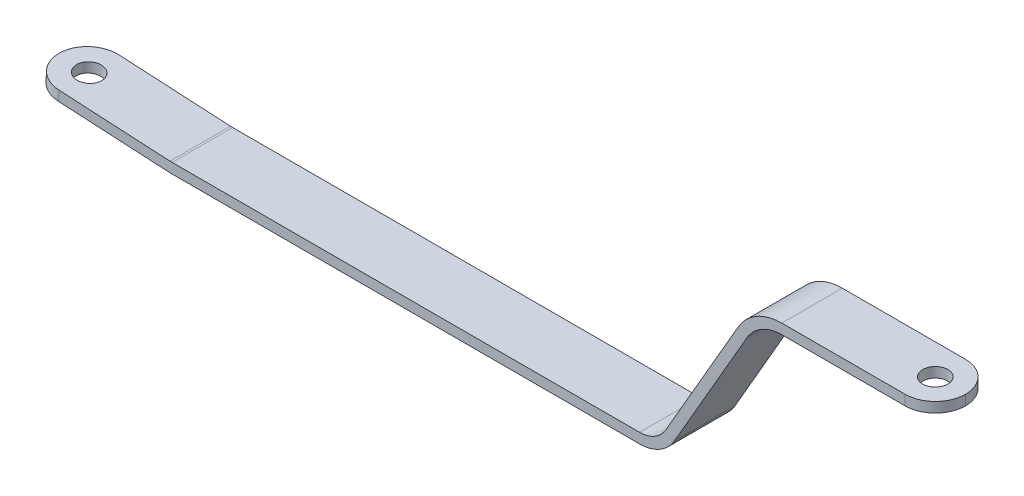
ISO-10303-21;
HEADER;
FILE_DESCRIPTION(('STEP AP214'),'2;1');
FILE_NAME('part.step','',(''),(''),'','','');
FILE_SCHEMA(('AUTOMOTIVE_DESIGN { 1 0 10303 214 1 1 1 1 }'));
ENDSEC;
DATA;
#1=APPLICATION_CONTEXT('core data for automotive mechanical design processes');
#2=APPLICATION_PROTOCOL_DEFINITION('international standard','automotive_design',2000,#1);
#3=PRODUCT_CONTEXT('',#1,'mechanical');
#4=PRODUCT('Part','Part','',(#3));
#5=PRODUCT_RELATED_PRODUCT_CATEGORY('part','',(#4));
#6=PRODUCT_DEFINITION_FORMATION('','',#4);
#7=PRODUCT_DEFINITION_CONTEXT('part definition',#1,'design');
#8=PRODUCT_DEFINITION('design','',#6,#7);
#9=PRODUCT_DEFINITION_SHAPE('','',#8);
#10=(LENGTH_UNIT() NAMED_UNIT(*) SI_UNIT(.MILLI.,.METRE.));
#11=(NAMED_UNIT(*) PLANE_ANGLE_UNIT() SI_UNIT($,.RADIAN.));
#12=(NAMED_UNIT(*) SI_UNIT($,.STERADIAN.) SOLID_ANGLE_UNIT());
#13=UNCERTAINTY_MEASURE_WITH_UNIT(LENGTH_MEASURE(1.E-05),#10,'distance_accuracy_value','');
#14=(GEOMETRIC_REPRESENTATION_CONTEXT(3) GLOBAL_UNCERTAINTY_ASSIGNED_CONTEXT((#13)) GLOBAL_UNIT_ASSIGNED_CONTEXT((#10,
#11,#12)) REPRESENTATION_CONTEXT('',''));
#15=CARTESIAN_POINT('',(0.,0.,0.));
#16=DIRECTION('',(0.,0.,1.));
#17=DIRECTION('',(1.,0.,0.));
#18=AXIS2_PLACEMENT_3D('',#15,#16,#17);
#19=CARTESIAN_POINT('',(74.7604405789944,15.6717298162515,3.));
#20=DIRECTION('',(0.,1.,0.));
#21=DIRECTION('',(0.,0.,1.));
#22=AXIS2_PLACEMENT_3D('',#19,#20,#21);
#23=PLANE('',#22);
#24=CARTESIAN_POINT('',(86.99,15.6717298162515,0.));
#25=DIRECTION('',(0.,1.,0.));
#26=DIRECTION('',(0.,0.,1.));
#27=AXIS2_PLACEMENT_3D('',#24,#25,#26);
#28=CIRCLE('',#27,1.25);
#29=CARTESIAN_POINT('',(86.99,15.6717298162515,1.25));
#30=VERTEX_POINT('',#29);
#31=EDGE_CURVE('E296',#30,#30,#28,.F.);
#32=ORIENTED_EDGE('',*,*,#31,.F.);
#33=EDGE_LOOP('',(#32));
#34=FACE_BOUND('',#33,.T.);
#35=DIRECTION('',(1.,0.,0.));
#36=VECTOR('',#35,1.);
#37=CARTESIAN_POINT('',(74.7604405789944,15.6717298162515,-3.));
#38=LINE('',#37,#36);
#39=CARTESIAN_POINT('',(74.7604405789944,15.6717298162515,-3.));
#40=VERTEX_POINT('',#39);
#41=CARTESIAN_POINT('',(86.99,15.6717298162515,-3.));
#42=VERTEX_POINT('',#41);
#43=EDGE_CURVE('E211',#40,#42,#38,.T.);
#44=ORIENTED_EDGE('',*,*,#43,.T.);
#45=CARTESIAN_POINT('',(86.99,15.6717298162515,0.));
#46=DIRECTION('',(0.,1.,0.));
#47=DIRECTION('',(0.,0.,1.));
#48=AXIS2_PLACEMENT_3D('',#45,#46,#47);
#49=CIRCLE('',#48,3.);
#50=CARTESIAN_POINT('',(89.99,15.6717298162515,0.));
#51=VERTEX_POINT('',#50);
#52=EDGE_CURVE('E55',#42,#51,#49,.F.);
#53=ORIENTED_EDGE('',*,*,#52,.T.);
#54=CARTESIAN_POINT('',(86.99,15.6717298162515,0.));
#55=DIRECTION('',(0.,1.,0.));
#56=DIRECTION('',(0.,0.,1.));
#57=AXIS2_PLACEMENT_3D('',#54,#55,#56);
#58=CIRCLE('',#57,3.);
#59=CARTESIAN_POINT('',(86.99,15.6717298162515,3.));
#60=VERTEX_POINT('',#59);
#61=EDGE_CURVE('E286',#51,#60,#58,.F.);
#62=ORIENTED_EDGE('',*,*,#61,.T.);
#63=DIRECTION('',(1.,0.,0.));
#64=VECTOR('',#63,1.);
#65=CARTESIAN_POINT('',(74.7604405789944,15.6717298162515,3.));
#66=LINE('',#65,#64);
#67=CARTESIAN_POINT('',(74.7604405789944,15.6717298162515,3.));
#68=VERTEX_POINT('',#67);
#69=EDGE_CURVE('E179',#68,#60,#66,.T.);
#70=ORIENTED_EDGE('',*,*,#69,.F.);
#71=DIRECTION('',(0.,0.,-1.));
#72=VECTOR('',#71,1.);
#73=CARTESIAN_POINT('',(74.7604405789944,15.6717298162515,3.));
#74=LINE('',#73,#72);
#75=EDGE_CURVE('E210',#68,#40,#74,.T.);
#76=ORIENTED_EDGE('',*,*,#75,.T.);
#77=EDGE_LOOP('',(#44,#53,#62,#70,#76));
#78=FACE_BOUND('',#77,.T.);
#79=ADVANCED_FACE('F32',(#34,#78),#23,.F.);
#80=CARTESIAN_POINT('',(74.7604405789944,16.6717298162515,3.));
#81=DIRECTION('',(0.,1.,0.));
#82=DIRECTION('',(0.,0.,1.));
#83=AXIS2_PLACEMENT_3D('',#80,#81,#82);
#84=PLANE('',#83);
#85=CARTESIAN_POINT('',(86.99,16.6717298162515,0.));
#86=DIRECTION('',(0.,1.,0.));
#87=DIRECTION('',(0.,0.,1.));
#88=AXIS2_PLACEMENT_3D('',#85,#86,#87);
#89=CIRCLE('',#88,1.25);
#90=CARTESIAN_POINT('',(86.99,16.6717298162515,1.25));
#91=VERTEX_POINT('',#90);
#92=EDGE_CURVE('E291',#91,#91,#89,.T.);
#93=ORIENTED_EDGE('',*,*,#92,.F.);
#94=EDGE_LOOP('',(#93));
#95=FACE_BOUND('',#94,.T.);
#96=CARTESIAN_POINT('',(86.99,16.6717298162515,0.));
#97=DIRECTION('',(0.,1.,0.));
#98=DIRECTION('',(0.,0.,1.));
#99=AXIS2_PLACEMENT_3D('',#96,#97,#98);
#100=CIRCLE('',#99,3.);
#101=CARTESIAN_POINT('',(86.99,16.6717298162515,3.));
#102=VERTEX_POINT('',#101);
#103=CARTESIAN_POINT('',(89.99,16.6717298162515,0.));
#104=VERTEX_POINT('',#103);
#105=EDGE_CURVE('E41',#102,#104,#100,.T.);
#106=ORIENTED_EDGE('',*,*,#105,.T.);
#107=CARTESIAN_POINT('',(86.99,16.6717298162515,0.));
#108=DIRECTION('',(0.,1.,0.));
#109=DIRECTION('',(0.,0.,1.));
#110=AXIS2_PLACEMENT_3D('',#107,#108,#109);
#111=CIRCLE('',#110,3.);
#112=CARTESIAN_POINT('',(86.99,16.6717298162515,-3.));
#113=VERTEX_POINT('',#112);
#114=EDGE_CURVE('E11',#104,#113,#111,.T.);
#115=ORIENTED_EDGE('',*,*,#114,.T.);
#116=DIRECTION('',(1.,0.,0.));
#117=VECTOR('',#116,1.);
#118=CARTESIAN_POINT('',(74.7604405789944,16.6717298162515,-3.));
#119=LINE('',#118,#117);
#120=CARTESIAN_POINT('',(74.7604405789944,16.6717298162515,-3.));
#121=VERTEX_POINT('',#120);
#122=EDGE_CURVE('E161',#121,#113,#119,.T.);
#123=ORIENTED_EDGE('',*,*,#122,.F.);
#124=DIRECTION('',(0.,0.,-1.));
#125=VECTOR('',#124,1.);
#126=CARTESIAN_POINT('',(74.7604405789944,16.6717298162515,3.));
#127=LINE('',#126,#125);
#128=CARTESIAN_POINT('',(74.7604405789944,16.6717298162515,3.));
#129=VERTEX_POINT('',#128);
#130=EDGE_CURVE('E156',#129,#121,#127,.T.);
#131=ORIENTED_EDGE('',*,*,#130,.F.);
#132=DIRECTION('',(1.,0.,0.));
#133=VECTOR('',#132,1.);
#134=CARTESIAN_POINT('',(74.7604405789944,16.6717298162515,3.));
#135=LINE('',#134,#133);
#136=EDGE_CURVE('E159',#129,#102,#135,.T.);
#137=ORIENTED_EDGE('',*,*,#136,.T.);
#138=EDGE_LOOP('',(#106,#115,#123,#131,#137));
#139=FACE_BOUND('',#138,.T.);
#140=ADVANCED_FACE('F158',(#95,#139),#84,.T.);
#141=CARTESIAN_POINT('',(74.7604405789944,11.6717298162515,3.));
#142=DIRECTION('',(0.,0.,-1.));
#143=DIRECTION('',(-1.,0.,0.));
#144=AXIS2_PLACEMENT_3D('',#141,#142,#143);
#145=CYLINDRICAL_SURFACE('',#144,5.00000000000001);
#146=CARTESIAN_POINT('',(74.7604405789944,11.6717298162515,-3.));
#147=DIRECTION('',(0.,0.,1.));
#148=DIRECTION('',(1.,0.,0.));
#149=AXIS2_PLACEMENT_3D('',#146,#147,#148);
#150=CIRCLE('',#149,5.00000000000001);
#151=CARTESIAN_POINT('',(70.4303135600722,14.1717298162515,-3.));
#152=VERTEX_POINT('',#151);
#153=EDGE_CURVE('E215',#152,#121,#150,.F.);
#154=ORIENTED_EDGE('',*,*,#153,.F.);
#155=DIRECTION('',(0.,0.,-1.));
#156=VECTOR('',#155,1.);
#157=CARTESIAN_POINT('',(70.4303135600722,14.1717298162515,3.));
#158=LINE('',#157,#156);
#159=CARTESIAN_POINT('',(70.4303135600722,14.1717298162515,3.));
#160=VERTEX_POINT('',#159);
#161=EDGE_CURVE('E167',#160,#152,#158,.T.);
#162=ORIENTED_EDGE('',*,*,#161,.F.);
#163=CARTESIAN_POINT('',(74.7604405789944,11.6717298162515,3.));
#164=DIRECTION('',(0.,0.,1.));
#165=DIRECTION('',(1.,0.,0.));
#166=AXIS2_PLACEMENT_3D('',#163,#164,#165);
#167=CIRCLE('',#166,5.00000000000001);
#168=EDGE_CURVE('E174',#160,#129,#167,.F.);
#169=ORIENTED_EDGE('',*,*,#168,.T.);
#170=ORIENTED_EDGE('',*,*,#130,.T.);
#171=EDGE_LOOP('',(#154,#162,#169,#170));
#172=FACE_BOUND('',#171,.T.);
#173=ADVANCED_FACE('F181',(#172),#145,.T.);
#174=CARTESIAN_POINT('',(63.2480762113533,1.7317298162515,3.));
#175=DIRECTION('',(-0.86602540378444,0.499999999999997,0.));
#176=DIRECTION('',(-0.499999999999997,-0.86602540378444,0.));
#177=AXIS2_PLACEMENT_3D('',#174,#175,#176);
#178=PLANE('',#177);
#179=DIRECTION('',(0.499999999999997,0.86602540378444,0.));
#180=VECTOR('',#179,1.);
#181=CARTESIAN_POINT('',(63.2480762113533,1.7317298162515,-3.));
#182=LINE('',#181,#180);
#183=CARTESIAN_POINT('',(63.2480762113533,1.7317298162515,-3.));
#184=VERTEX_POINT('',#183);
#185=EDGE_CURVE('E217',#184,#152,#182,.T.);
#186=ORIENTED_EDGE('',*,*,#185,.F.);
#187=DIRECTION('',(0.,0.,-1.));
#188=VECTOR('',#187,1.);
#189=CARTESIAN_POINT('',(63.2480762113533,1.7317298162515,3.));
#190=LINE('',#189,#188);
#191=CARTESIAN_POINT('',(63.2480762113533,1.7317298162515,3.));
#192=VERTEX_POINT('',#191);
#193=EDGE_CURVE('E267',#192,#184,#190,.T.);
#194=ORIENTED_EDGE('',*,*,#193,.F.);
#195=DIRECTION('',(0.499999999999997,0.86602540378444,0.));
#196=VECTOR('',#195,1.);
#197=CARTESIAN_POINT('',(63.2480762113533,1.7317298162515,3.));
#198=LINE('',#197,#196);
#199=EDGE_CURVE('E182',#192,#160,#198,.T.);
#200=ORIENTED_EDGE('',*,*,#199,.T.);
#201=ORIENTED_EDGE('',*,*,#161,.T.);
#202=EDGE_LOOP('',(#186,#194,#200,#201));
#203=FACE_BOUND('',#202,.T.);
#204=ADVANCED_FACE('F456',(#203),#178,.T.);
#205=CARTESIAN_POINT('',(60.65,3.2317298162515,3.));
#206=DIRECTION('',(0.,0.,-1.));
#207=DIRECTION('',(-1.,0.,0.));
#208=AXIS2_PLACEMENT_3D('',#205,#206,#207);
#209=CYLINDRICAL_SURFACE('',#208,3.);
#210=CARTESIAN_POINT('',(60.65,3.2317298162515,-3.));
#211=DIRECTION('',(0.,0.,1.));
#212=DIRECTION('',(1.,0.,0.));
#213=AXIS2_PLACEMENT_3D('',#210,#211,#212);
#214=CIRCLE('',#213,3.);
#215=CARTESIAN_POINT('',(60.65,0.231729816251496,-3.));
#216=VERTEX_POINT('',#215);
#217=EDGE_CURVE('E220',#216,#184,#214,.T.);
#218=ORIENTED_EDGE('',*,*,#217,.F.);
#219=DIRECTION('',(0.,0.,-1.));
#220=VECTOR('',#219,1.);
#221=CARTESIAN_POINT('',(60.65,0.231729816251496,3.));
#222=LINE('',#221,#220);
#223=CARTESIAN_POINT('',(60.65,0.231729816251496,3.));
#224=VERTEX_POINT('',#223);
#225=EDGE_CURVE('E265',#224,#216,#222,.T.);
#226=ORIENTED_EDGE('',*,*,#225,.F.);
#227=CARTESIAN_POINT('',(60.65,3.2317298162515,3.));
#228=DIRECTION('',(0.,0.,1.));
#229=DIRECTION('',(1.,0.,0.));
#230=AXIS2_PLACEMENT_3D('',#227,#228,#229);
#231=CIRCLE('',#230,3.);
#232=EDGE_CURVE('E184',#224,#192,#231,.T.);
#233=ORIENTED_EDGE('',*,*,#232,.T.);
#234=ORIENTED_EDGE('',*,*,#193,.T.);
#235=EDGE_LOOP('',(#218,#226,#233,#234));
#236=FACE_BOUND('',#235,.T.);
#237=ADVANCED_FACE('F448',(#236),#209,.F.);
#238=CARTESIAN_POINT('',(14.2757326766331,0.231729816251496,3.));
#239=DIRECTION('',(0.,1.,0.));
#240=DIRECTION('',(-1.,0.,0.));
#241=AXIS2_PLACEMENT_3D('',#238,#239,#240);
#242=PLANE('',#241);
#243=DIRECTION('',(1.,0.,0.));
#244=VECTOR('',#243,1.);
#245=CARTESIAN_POINT('',(14.2757326766331,0.231729816251496,-3.));
#246=LINE('',#245,#244);
#247=CARTESIAN_POINT('',(14.2757326766331,0.231729816251496,-3.));
#248=VERTEX_POINT('',#247);
#249=EDGE_CURVE('E223',#248,#216,#246,.T.);
#250=ORIENTED_EDGE('',*,*,#249,.F.);
#251=DIRECTION('',(0.,0.,-1.));
#252=VECTOR('',#251,1.);
#253=CARTESIAN_POINT('',(14.2757326766331,0.231729816251496,3.));
#254=LINE('',#253,#252);
#255=CARTESIAN_POINT('',(14.2757326766331,0.231729816251496,3.));
#256=VERTEX_POINT('',#255);
#257=EDGE_CURVE('E263',#256,#248,#254,.T.);
#258=ORIENTED_EDGE('',*,*,#257,.F.);
#259=DIRECTION('',(1.,0.,0.));
#260=VECTOR('',#259,1.);
#261=CARTESIAN_POINT('',(14.2757326766331,0.231729816251496,3.));
#262=LINE('',#261,#260);
#263=EDGE_CURVE('E190',#256,#224,#262,.T.);
#264=ORIENTED_EDGE('',*,*,#263,.T.);
#265=ORIENTED_EDGE('',*,*,#225,.T.);
#266=EDGE_LOOP('',(#250,#258,#264,#265));
#267=FACE_BOUND('',#266,.T.);
#268=ADVANCED_FACE('F440',(#267),#242,.T.);
#269=CARTESIAN_POINT('',(14.2757326766331,4.2317298162515,3.));
#270=DIRECTION('',(0.,0.,-1.));
#271=DIRECTION('',(-1.,0.,0.));
#272=AXIS2_PLACEMENT_3D('',#269,#270,#271);
#273=CYLINDRICAL_SURFACE('',#272,4.);
#274=CARTESIAN_POINT('',(14.2757326766331,4.2317298162515,-3.));
#275=DIRECTION('',(0.,0.,1.));
#276=DIRECTION('',(1.,0.,0.));
#277=AXIS2_PLACEMENT_3D('',#274,#275,#276);
#278=CIRCLE('',#277,4.);
#279=CARTESIAN_POINT('',(14.0587203178882,0.237620949914477,-3.));
#280=VERTEX_POINT('',#279);
#281=EDGE_CURVE('E226',#280,#248,#278,.T.);
#282=ORIENTED_EDGE('',*,*,#281,.F.);
#283=DIRECTION('',(0.,0.,-1.));
#284=VECTOR('',#283,1.);
#285=CARTESIAN_POINT('',(14.0587203178882,0.237620949914477,3.));
#286=LINE('',#285,#284);
#287=CARTESIAN_POINT('',(14.0587203178882,0.237620949914477,3.));
#288=VERTEX_POINT('',#287);
#289=EDGE_CURVE('E260',#288,#280,#286,.T.);
#290=ORIENTED_EDGE('',*,*,#289,.F.);
#291=CARTESIAN_POINT('',(14.2757326766331,4.2317298162515,3.));
#292=DIRECTION('',(0.,0.,1.));
#293=DIRECTION('',(1.,0.,0.));
#294=AXIS2_PLACEMENT_3D('',#291,#292,#293);
#295=CIRCLE('',#294,4.);
#296=EDGE_CURVE('E193',#288,#256,#295,.T.);
#297=ORIENTED_EDGE('',*,*,#296,.T.);
#298=ORIENTED_EDGE('',*,*,#257,.T.);
#299=EDGE_LOOP('',(#282,#290,#297,#298));
#300=FACE_BOUND('',#299,.T.);
#301=ADVANCED_FACE('F432',(#300),#273,.F.);
#302=CARTESIAN_POINT('',(0.0542530896862141,0.998527216584255,3.));
#303=DIRECTION('',(0.0542530896862141,0.998527216584255,0.));
#304=DIRECTION('',(-0.998527216584255,0.0542530896862141,0.));
#305=AXIS2_PLACEMENT_3D('',#302,#303,#304);
#306=PLANE('',#305);
#307=CARTESIAN_POINT('',(3.04983473943898,0.835767947525613,0.));
#308=DIRECTION('',(0.0542530896862141,0.998527216584255,0.));
#309=DIRECTION('',(-0.998527216584255,0.0542530896862142,0.));
#310=AXIS2_PLACEMENT_3D('',#307,#308,#309);
#311=CIRCLE('',#310,1.25);
#312=CARTESIAN_POINT('',(1.80167571870866,0.903584309633381,0.));
#313=VERTEX_POINT('',#312);
#314=EDGE_CURVE('E310',#313,#313,#311,.T.);
#315=ORIENTED_EDGE('',*,*,#314,.F.);
#316=EDGE_LOOP('',(#315));
#317=FACE_BOUND('',#316,.T.);
#318=DIRECTION('',(0.998527216584255,-0.0542530896862141,0.));
#319=VECTOR('',#318,1.);
#320=CARTESIAN_POINT('',(0.0542530896862141,0.998527216584255,-3.));
#321=LINE('',#320,#319);
#322=CARTESIAN_POINT('',(3.04983473943896,0.835767947525614,-3.));
#323=VERTEX_POINT('',#322);
#324=EDGE_CURVE('E229',#323,#280,#321,.T.);
#325=ORIENTED_EDGE('',*,*,#324,.F.);
#326=CARTESIAN_POINT('',(3.04983473943896,0.835767947525611,0.));
#327=DIRECTION('',(0.0542530896862141,0.998527216584255,0.));
#328=DIRECTION('',(-0.998527216584255,0.0542530896862141,0.));
#329=AXIS2_PLACEMENT_3D('',#326,#327,#328);
#330=CIRCLE('',#329,3.);
#331=CARTESIAN_POINT('',(0.0542530896862141,0.998527216584255,0.));
#332=VERTEX_POINT('',#331);
#333=EDGE_CURVE('E277',#323,#332,#330,.T.);
#334=ORIENTED_EDGE('',*,*,#333,.T.);
#335=CARTESIAN_POINT('',(3.04983473943898,0.835767947525613,0.));
#336=DIRECTION('',(0.0542530896862141,0.998527216584255,0.));
#337=DIRECTION('',(-0.998527216584255,0.0542530896862141,0.));
#338=AXIS2_PLACEMENT_3D('',#335,#336,#337);
#339=CIRCLE('',#338,3.);
#340=CARTESIAN_POINT('',(3.04983473943898,0.835767947525613,3.));
#341=VERTEX_POINT('',#340);
#342=EDGE_CURVE('E275',#332,#341,#339,.T.);
#343=ORIENTED_EDGE('',*,*,#342,.T.);
#344=DIRECTION('',(0.998527216584255,-0.0542530896862141,0.));
#345=VECTOR('',#344,1.);
#346=CARTESIAN_POINT('',(0.0542530896862141,0.998527216584255,3.));
#347=LINE('',#346,#345);
#348=EDGE_CURVE('E196',#341,#288,#347,.T.);
#349=ORIENTED_EDGE('',*,*,#348,.T.);
#350=ORIENTED_EDGE('',*,*,#289,.T.);
#351=EDGE_LOOP('',(#325,#334,#343,#349,#350));
#352=FACE_BOUND('',#351,.T.);
#353=ADVANCED_FACE('F424',(#317,#352),#306,.T.);
#354=CARTESIAN_POINT('',(0.,0.,3.));
#355=DIRECTION('',(0.0542530896862141,0.998527216584255,0.));
#356=DIRECTION('',(-0.998527216584255,0.0542530896862141,0.));
#357=AXIS2_PLACEMENT_3D('',#354,#355,#356);
#358=PLANE('',#357);
#359=CARTESIAN_POINT('',(2.99558164975276,-0.162759269058642,0.));
#360=DIRECTION('',(0.0542530896862141,0.998527216584255,0.));
#361=DIRECTION('',(-0.998527216584255,0.0542530896862141,0.));
#362=AXIS2_PLACEMENT_3D('',#359,#360,#361);
#363=CIRCLE('',#362,1.25);
#364=CARTESIAN_POINT('',(1.74742262902245,-0.0949429069508747,0.));
#365=VERTEX_POINT('',#364);
#366=EDGE_CURVE('E213',#365,#365,#363,.F.);
#367=ORIENTED_EDGE('',*,*,#366,.F.);
#368=EDGE_LOOP('',(#367));
#369=FACE_BOUND('',#368,.T.);
#370=CARTESIAN_POINT('',(2.99558164975276,-0.162759269058642,0.));
#371=DIRECTION('',(0.0542530896862141,0.998527216584255,0.));
#372=DIRECTION('',(-0.998527216584255,0.0542530896862141,0.));
#373=AXIS2_PLACEMENT_3D('',#370,#371,#372);
#374=CIRCLE('',#373,3.);
#375=CARTESIAN_POINT('',(2.99558164975277,-0.162759269058642,3.));
#376=VERTEX_POINT('',#375);
#377=CARTESIAN_POINT('',(0.,0.,0.));
#378=VERTEX_POINT('',#377);
#379=EDGE_CURVE('E279',#376,#378,#374,.F.);
#380=ORIENTED_EDGE('',*,*,#379,.T.);
#381=CARTESIAN_POINT('',(2.99558164975274,-0.162759269058644,0.));
#382=DIRECTION('',(0.0542530896862141,0.998527216584255,0.));
#383=DIRECTION('',(-0.998527216584255,0.0542530896862141,0.));
#384=AXIS2_PLACEMENT_3D('',#381,#382,#383);
#385=CIRCLE('',#384,3.);
#386=CARTESIAN_POINT('',(2.99558164975275,-0.162759269058641,-3.));
#387=VERTEX_POINT('',#386);
#388=EDGE_CURVE('E281',#378,#387,#385,.F.);
#389=ORIENTED_EDGE('',*,*,#388,.T.);
#390=DIRECTION('',(0.998527216584255,-0.0542530896862141,0.));
#391=VECTOR('',#390,1.);
#392=CARTESIAN_POINT('',(0.,0.,-3.));
#393=LINE('',#392,#391);
#394=CARTESIAN_POINT('',(14.004467228202,-0.760906266669778,-3.));
#395=VERTEX_POINT('',#394);
#396=EDGE_CURVE('E231',#387,#395,#393,.T.);
#397=ORIENTED_EDGE('',*,*,#396,.T.);
#398=DIRECTION('',(0.,0.,-1.));
#399=VECTOR('',#398,1.);
#400=CARTESIAN_POINT('',(14.004467228202,-0.760906266669778,3.));
#401=LINE('',#400,#399);
#402=CARTESIAN_POINT('',(14.004467228202,-0.760906266669778,3.));
#403=VERTEX_POINT('',#402);
#404=EDGE_CURVE('E257',#403,#395,#401,.T.);
#405=ORIENTED_EDGE('',*,*,#404,.F.);
#406=DIRECTION('',(0.998527216584255,-0.0542530896862141,0.));
#407=VECTOR('',#406,1.);
#408=CARTESIAN_POINT('',(0.,0.,3.));
#409=LINE('',#408,#407);
#410=EDGE_CURVE('E198',#376,#403,#409,.T.);
#411=ORIENTED_EDGE('',*,*,#410,.F.);
#412=EDGE_LOOP('',(#380,#389,#397,#405,#411));
#413=FACE_BOUND('',#412,.T.);
#414=ADVANCED_FACE('F416',(#369,#413),#358,.F.);
#415=CARTESIAN_POINT('',(14.2757326766331,4.2317298162515,3.));
#416=DIRECTION('',(0.,0.,-1.));
#417=DIRECTION('',(-1.,0.,0.));
#418=AXIS2_PLACEMENT_3D('',#415,#416,#417);
#419=CYLINDRICAL_SURFACE('',#418,5.);
#420=CARTESIAN_POINT('',(14.2757326766331,4.2317298162515,-3.));
#421=DIRECTION('',(0.,0.,1.));
#422=DIRECTION('',(1.,0.,0.));
#423=AXIS2_PLACEMENT_3D('',#420,#421,#422);
#424=CIRCLE('',#423,5.);
#425=CARTESIAN_POINT('',(14.2757326766331,-0.768270183748504,-3.));
#426=VERTEX_POINT('',#425);
#427=EDGE_CURVE('E233',#395,#426,#424,.T.);
#428=ORIENTED_EDGE('',*,*,#427,.T.);
#429=DIRECTION('',(0.,0.,-1.));
#430=VECTOR('',#429,1.);
#431=CARTESIAN_POINT('',(14.2757326766331,-0.768270183748504,3.));
#432=LINE('',#431,#430);
#433=CARTESIAN_POINT('',(14.2757326766331,-0.768270183748504,3.));
#434=VERTEX_POINT('',#433);
#435=EDGE_CURVE('E254',#434,#426,#432,.T.);
#436=ORIENTED_EDGE('',*,*,#435,.F.);
#437=CARTESIAN_POINT('',(14.2757326766331,4.2317298162515,3.));
#438=DIRECTION('',(0.,0.,1.));
#439=DIRECTION('',(1.,0.,0.));
#440=AXIS2_PLACEMENT_3D('',#437,#438,#439);
#441=CIRCLE('',#440,5.);
#442=EDGE_CURVE('E200',#403,#434,#441,.T.);
#443=ORIENTED_EDGE('',*,*,#442,.F.);
#444=ORIENTED_EDGE('',*,*,#404,.T.);
#445=EDGE_LOOP('',(#428,#436,#443,#444));
#446=FACE_BOUND('',#445,.T.);
#447=ADVANCED_FACE('F408',(#446),#419,.T.);
#448=CARTESIAN_POINT('',(14.2757326766331,-0.768270183748504,3.));
#449=DIRECTION('',(0.,1.,0.));
#450=DIRECTION('',(-1.,0.,0.));
#451=AXIS2_PLACEMENT_3D('',#448,#449,#450);
#452=PLANE('',#451);
#453=DIRECTION('',(1.,0.,0.));
#454=VECTOR('',#453,1.);
#455=CARTESIAN_POINT('',(14.2757326766331,-0.768270183748504,-3.));
#456=LINE('',#455,#454);
#457=CARTESIAN_POINT('',(60.65,-0.768270183748504,-3.));
#458=VERTEX_POINT('',#457);
#459=EDGE_CURVE('E235',#426,#458,#456,.T.);
#460=ORIENTED_EDGE('',*,*,#459,.T.);
#461=DIRECTION('',(0.,0.,-1.));
#462=VECTOR('',#461,1.);
#463=CARTESIAN_POINT('',(60.65,-0.768270183748504,3.));
#464=LINE('',#463,#462);
#465=CARTESIAN_POINT('',(60.65,-0.768270183748504,3.));
#466=VERTEX_POINT('',#465);
#467=EDGE_CURVE('E251',#466,#458,#464,.T.);
#468=ORIENTED_EDGE('',*,*,#467,.F.);
#469=DIRECTION('',(1.,0.,0.));
#470=VECTOR('',#469,1.);
#471=CARTESIAN_POINT('',(14.2757326766331,-0.768270183748504,3.));
#472=LINE('',#471,#470);
#473=EDGE_CURVE('E202',#434,#466,#472,.T.);
#474=ORIENTED_EDGE('',*,*,#473,.F.);
#475=ORIENTED_EDGE('',*,*,#435,.T.);
#476=EDGE_LOOP('',(#460,#468,#474,#475));
#477=FACE_BOUND('',#476,.T.);
#478=ADVANCED_FACE('F400',(#477),#452,.F.);
#479=CARTESIAN_POINT('',(60.65,3.2317298162515,3.));
#480=DIRECTION('',(0.,0.,-1.));
#481=DIRECTION('',(-1.,0.,0.));
#482=AXIS2_PLACEMENT_3D('',#479,#480,#481);
#483=CYLINDRICAL_SURFACE('',#482,4.);
#484=CARTESIAN_POINT('',(60.65,3.2317298162515,-3.));
#485=DIRECTION('',(0.,0.,1.));
#486=DIRECTION('',(1.,0.,0.));
#487=AXIS2_PLACEMENT_3D('',#484,#485,#486);
#488=CIRCLE('',#487,4.);
#489=CARTESIAN_POINT('',(64.1141016151378,1.2317298162515,-3.));
#490=VERTEX_POINT('',#489);
#491=EDGE_CURVE('E237',#458,#490,#488,.T.);
#492=ORIENTED_EDGE('',*,*,#491,.T.);
#493=DIRECTION('',(0.,0.,-1.));
#494=VECTOR('',#493,1.);
#495=CARTESIAN_POINT('',(64.1141016151378,1.2317298162515,3.));
#496=LINE('',#495,#494);
#497=CARTESIAN_POINT('',(64.1141016151378,1.2317298162515,3.));
#498=VERTEX_POINT('',#497);
#499=EDGE_CURVE('E248',#498,#490,#496,.T.);
#500=ORIENTED_EDGE('',*,*,#499,.F.);
#501=CARTESIAN_POINT('',(60.65,3.2317298162515,3.));
#502=DIRECTION('',(0.,0.,1.));
#503=DIRECTION('',(1.,0.,0.));
#504=AXIS2_PLACEMENT_3D('',#501,#502,#503);
#505=CIRCLE('',#504,4.);
#506=EDGE_CURVE('E204',#466,#498,#505,.T.);
#507=ORIENTED_EDGE('',*,*,#506,.F.);
#508=ORIENTED_EDGE('',*,*,#467,.T.);
#509=EDGE_LOOP('',(#492,#500,#507,#508));
#510=FACE_BOUND('',#509,.T.);
#511=ADVANCED_FACE('F392',(#510),#483,.T.);
#512=CARTESIAN_POINT('',(64.1141016151378,1.2317298162515,3.));
#513=DIRECTION('',(-0.86602540378444,0.499999999999997,0.));
#514=DIRECTION('',(-0.499999999999997,-0.86602540378444,0.));
#515=AXIS2_PLACEMENT_3D('',#512,#513,#514);
#516=PLANE('',#515);
#517=DIRECTION('',(0.499999999999997,0.86602540378444,0.));
#518=VECTOR('',#517,1.);
#519=CARTESIAN_POINT('',(64.1141016151378,1.2317298162515,-3.));
#520=LINE('',#519,#518);
#521=CARTESIAN_POINT('',(71.2963389638566,13.6717298162515,-3.));
#522=VERTEX_POINT('',#521);
#523=EDGE_CURVE('E239',#490,#522,#520,.T.);
#524=ORIENTED_EDGE('',*,*,#523,.T.);
#525=DIRECTION('',(0.,0.,-1.));
#526=VECTOR('',#525,1.);
#527=CARTESIAN_POINT('',(71.2963389638566,13.6717298162515,3.));
#528=LINE('',#527,#526);
#529=CARTESIAN_POINT('',(71.2963389638566,13.6717298162515,3.));
#530=VERTEX_POINT('',#529);
#531=EDGE_CURVE('E245',#530,#522,#528,.T.);
#532=ORIENTED_EDGE('',*,*,#531,.F.);
#533=DIRECTION('',(0.499999999999997,0.86602540378444,0.));
#534=VECTOR('',#533,1.);
#535=CARTESIAN_POINT('',(64.1141016151378,1.2317298162515,3.));
#536=LINE('',#535,#534);
#537=EDGE_CURVE('E206',#498,#530,#536,.T.);
#538=ORIENTED_EDGE('',*,*,#537,.F.);
#539=ORIENTED_EDGE('',*,*,#499,.T.);
#540=EDGE_LOOP('',(#524,#532,#538,#539));
#541=FACE_BOUND('',#540,.T.);
#542=ADVANCED_FACE('F384',(#541),#516,.F.);
#543=CARTESIAN_POINT('',(74.7604405789944,11.6717298162515,3.));
#544=DIRECTION('',(0.,0.,-1.));
#545=DIRECTION('',(-1.,0.,0.));
#546=AXIS2_PLACEMENT_3D('',#543,#544,#545);
#547=CYLINDRICAL_SURFACE('',#546,4.00000000000001);
#548=CARTESIAN_POINT('',(74.7604405789944,11.6717298162515,-3.));
#549=DIRECTION('',(0.,0.,-1.));
#550=DIRECTION('',(-1.,0.,0.));
#551=AXIS2_PLACEMENT_3D('',#548,#549,#550);
#552=CIRCLE('',#551,4.00000000000001);
#553=EDGE_CURVE('E241',#522,#40,#552,.T.);
#554=ORIENTED_EDGE('',*,*,#553,.T.);
#555=ORIENTED_EDGE('',*,*,#75,.F.);
#556=CARTESIAN_POINT('',(74.7604405789944,11.6717298162515,3.));
#557=DIRECTION('',(0.,0.,-1.));
#558=DIRECTION('',(-1.,0.,0.));
#559=AXIS2_PLACEMENT_3D('',#556,#557,#558);
#560=CIRCLE('',#559,4.00000000000001);
#561=EDGE_CURVE('E208',#530,#68,#560,.T.);
#562=ORIENTED_EDGE('',*,*,#561,.F.);
#563=ORIENTED_EDGE('',*,*,#531,.T.);
#564=EDGE_LOOP('',(#554,#555,#562,#563));
#565=FACE_BOUND('',#564,.T.);
#566=ADVANCED_FACE('F377',(#565),#547,.F.);
#567=CARTESIAN_POINT('',(74.7604405789944,11.6717298162515,3.));
#568=DIRECTION('',(0.,0.,1.));
#569=DIRECTION('',(1.,0.,0.));
#570=AXIS2_PLACEMENT_3D('',#567,#568,#569);
#571=PLANE('',#570);
#572=ORIENTED_EDGE('',*,*,#348,.F.);
#573=DIRECTION('',(0.0542530896862141,0.998527216584255,0.));
#574=VECTOR('',#573,1.);
#575=CARTESIAN_POINT('',(3.84792615932637,15.5246273044599,3.));
#576=LINE('',#575,#574);
#577=EDGE_CURVE('E284',#341,#376,#576,.F.);
#578=ORIENTED_EDGE('',*,*,#577,.T.);
#579=ORIENTED_EDGE('',*,*,#410,.T.);
#580=ORIENTED_EDGE('',*,*,#442,.T.);
#581=ORIENTED_EDGE('',*,*,#473,.T.);
#582=ORIENTED_EDGE('',*,*,#506,.T.);
#583=ORIENTED_EDGE('',*,*,#537,.T.);
#584=ORIENTED_EDGE('',*,*,#561,.T.);
#585=ORIENTED_EDGE('',*,*,#69,.T.);
#586=DIRECTION('',(0.,-1.,0.));
#587=VECTOR('',#586,1.);
#588=CARTESIAN_POINT('',(86.99,11.6717298162515,3.));
#589=LINE('',#588,#587);
#590=EDGE_CURVE('E178',#60,#102,#589,.F.);
#591=ORIENTED_EDGE('',*,*,#590,.T.);
#592=ORIENTED_EDGE('',*,*,#136,.F.);
#593=ORIENTED_EDGE('',*,*,#168,.F.);
#594=ORIENTED_EDGE('',*,*,#199,.F.);
#595=ORIENTED_EDGE('',*,*,#232,.F.);
#596=ORIENTED_EDGE('',*,*,#263,.F.);
#597=ORIENTED_EDGE('',*,*,#296,.F.);
#598=EDGE_LOOP('',(#572,#578,#579,#580,#581,#582,#583,#584,#585,#591,#592,#593,#594,#595,#596,#597));
#599=FACE_BOUND('',#598,.T.);
#600=ADVANCED_FACE('F172',(#599),#571,.T.);
#601=CARTESIAN_POINT('',(74.7604405789944,11.6717298162515,-3.));
#602=DIRECTION('',(0.,0.,1.));
#603=DIRECTION('',(1.,0.,0.));
#604=AXIS2_PLACEMENT_3D('',#601,#602,#603);
#605=PLANE('',#604);
#606=ORIENTED_EDGE('',*,*,#396,.F.);
#607=DIRECTION('',(0.0542530896862141,0.998527216584255,0.));
#608=VECTOR('',#607,1.);
#609=CARTESIAN_POINT('',(3.04983473943896,0.835767947525611,-3.));
#610=LINE('',#609,#608);
#611=EDGE_CURVE('E272',#387,#323,#610,.T.);
#612=ORIENTED_EDGE('',*,*,#611,.T.);
#613=ORIENTED_EDGE('',*,*,#324,.T.);
#614=ORIENTED_EDGE('',*,*,#281,.T.);
#615=ORIENTED_EDGE('',*,*,#249,.T.);
#616=ORIENTED_EDGE('',*,*,#217,.T.);
#617=ORIENTED_EDGE('',*,*,#185,.T.);
#618=ORIENTED_EDGE('',*,*,#153,.T.);
#619=ORIENTED_EDGE('',*,*,#122,.T.);
#620=DIRECTION('',(0.,-1.,0.));
#621=VECTOR('',#620,1.);
#622=CARTESIAN_POINT('',(86.99,15.6717298162515,-3.));
#623=LINE('',#622,#621);
#624=EDGE_CURVE('E166',#113,#42,#623,.T.);
#625=ORIENTED_EDGE('',*,*,#624,.T.);
#626=ORIENTED_EDGE('',*,*,#43,.F.);
#627=ORIENTED_EDGE('',*,*,#553,.F.);
#628=ORIENTED_EDGE('',*,*,#523,.F.);
#629=ORIENTED_EDGE('',*,*,#491,.F.);
#630=ORIENTED_EDGE('',*,*,#459,.F.);
#631=ORIENTED_EDGE('',*,*,#427,.F.);
#632=EDGE_LOOP('',(#606,#612,#613,#614,#615,#616,#617,#618,#619,#625,#626,#627,#628,#629,#630,#631));
#633=FACE_BOUND('',#632,.T.);
#634=ADVANCED_FACE('F362',(#633),#605,.F.);
#635=CARTESIAN_POINT('',(2.95390488911771,-0.929819357873102,0.));
#636=DIRECTION('',(0.0542530896862141,0.998527216584255,0.));
#637=DIRECTION('',(-0.998527216584255,0.0542530896862142,0.));
#638=AXIS2_PLACEMENT_3D('',#635,#636,#637);
#639=CYLINDRICAL_SURFACE('',#638,1.25);
#640=CARTESIAN_POINT('',(1.80167571870866,0.903584309633381,0.));
#641=CARTESIAN_POINT('',(1.80111058235776,0.893182984460628,0.));
#642=CARTESIAN_POINT('',(1.80054544600687,0.882781659287875,0.));
#643=CARTESIAN_POINT('',(1.79941517330507,0.86197900894237,0.));
#644=CARTESIAN_POINT('',(1.79885003695417,0.851577683769617,0.));
#645=CARTESIAN_POINT('',(1.79771976425238,0.830775033424112,0.));
#646=CARTESIAN_POINT('',(1.79715462790148,0.820373708251359,0.));
#647=CARTESIAN_POINT('',(1.79602435519968,0.799571057905854,0.));
#648=CARTESIAN_POINT('',(1.79545921884878,0.789169732733101,0.));
#649=CARTESIAN_POINT('',(1.79432894614699,0.768367082387596,0.));
#650=CARTESIAN_POINT('',(1.79376380979609,0.757965757214843,0.));
#651=CARTESIAN_POINT('',(1.79263353709429,0.737163106869338,0.));
#652=CARTESIAN_POINT('',(1.79206840074339,0.726761781696585,0.));
#653=CARTESIAN_POINT('',(1.7909381280416,0.70595913135108,0.));
#654=CARTESIAN_POINT('',(1.7903729916907,0.695557806178327,0.));
#655=CARTESIAN_POINT('',(1.7892427189889,0.674755155832822,0.));
#656=CARTESIAN_POINT('',(1.78867758263801,0.664353830660069,0.));
#657=CARTESIAN_POINT('',(1.78754730993621,0.643551180314564,0.));
#658=CARTESIAN_POINT('',(1.78698217358531,0.633149855141811,0.));
#659=CARTESIAN_POINT('',(1.78585190088352,0.612347204796306,0.));
#660=CARTESIAN_POINT('',(1.78528676453262,0.601945879623553,0.));
#661=CARTESIAN_POINT('',(1.78415649183082,0.581143229278048,0.));
#662=CARTESIAN_POINT('',(1.78359135547992,0.570741904105295,0.));
#663=CARTESIAN_POINT('',(1.78246108277813,0.54993925375979,0.));
#664=CARTESIAN_POINT('',(1.78189594642723,0.539537928587038,0.));
#665=CARTESIAN_POINT('',(1.78076567372543,0.518735278241532,0.));
#666=CARTESIAN_POINT('',(1.78020053737454,0.50833395306878,0.));
#667=CARTESIAN_POINT('',(1.77907026467274,0.487531302723274,0.));
#668=CARTESIAN_POINT('',(1.77850512832184,0.477129977550522,0.));
#669=CARTESIAN_POINT('',(1.77737485562004,0.456327327205016,0.));
#670=CARTESIAN_POINT('',(1.77680971926915,0.445926002032264,0.));
#671=CARTESIAN_POINT('',(1.77567944656735,0.425123351686758,0.));
#672=CARTESIAN_POINT('',(1.77511431021645,0.414722026514006,0.));
#673=CARTESIAN_POINT('',(1.77398403751466,0.3939193761685,0.));
#674=CARTESIAN_POINT('',(1.77341890116376,0.383518050995748,0.));
#675=CARTESIAN_POINT('',(1.77228862846196,0.362715400650242,0.));
#676=CARTESIAN_POINT('',(1.77172349211106,0.35231407547749,0.));
#677=CARTESIAN_POINT('',(1.77059321940927,0.331511425131984,0.));
#678=CARTESIAN_POINT('',(1.77002808305837,0.321110099959232,0.));
#679=CARTESIAN_POINT('',(1.76889781035657,0.300307449613726,0.));
#680=CARTESIAN_POINT('',(1.76833267400568,0.289906124440974,0.));
#681=CARTESIAN_POINT('',(1.76720240130388,0.269103474095468,0.));
#682=CARTESIAN_POINT('',(1.76663726495298,0.258702148922716,0.));
#683=CARTESIAN_POINT('',(1.76550699225119,0.237899498577211,0.));
#684=CARTESIAN_POINT('',(1.76494185590029,0.227498173404458,0.));
#685=CARTESIAN_POINT('',(1.76381158319849,0.206695523058953,0.));
#686=CARTESIAN_POINT('',(1.76324644684759,0.1962941978862,0.));
#687=CARTESIAN_POINT('',(1.7621161741458,0.175491547540695,0.));
#688=CARTESIAN_POINT('',(1.7615510377949,0.165090222367942,0.));
#689=CARTESIAN_POINT('',(1.7604207650931,0.144287572022437,0.));
#690=CARTESIAN_POINT('',(1.7598556287422,0.133886246849684,0.));
#691=CARTESIAN_POINT('',(1.75872535604041,0.113083596504179,0.));
#692=CARTESIAN_POINT('',(1.75816021968951,0.102682271331426,0.));
#693=CARTESIAN_POINT('',(1.75702994698771,0.0818796209859205,0.));
#694=CARTESIAN_POINT('',(1.75646481063682,0.0714782958131678,0.));
#695=CARTESIAN_POINT('',(1.75533453793502,0.0506756454676625,0.));
#696=CARTESIAN_POINT('',(1.75476940158412,0.0402743202949098,0.));
#697=CARTESIAN_POINT('',(1.75363912888233,0.0194716699494046,0.));
#698=CARTESIAN_POINT('',(1.75307399253143,0.00907034477665195,0.));
#699=CARTESIAN_POINT('',(1.75194371982963,-0.0117323055688534,0.));
#700=CARTESIAN_POINT('',(1.75137858347873,-0.022133630741606,0.));
#701=CARTESIAN_POINT('',(1.75024831077694,-0.0429362810871114,0.));
#702=CARTESIAN_POINT('',(1.74968317442604,-0.053337606259864,0.));
#703=CARTESIAN_POINT('',(1.74855290172424,-0.0741402566053694,0.));
#704=CARTESIAN_POINT('',(1.74798776537335,-0.0845415817781221,0.));
#705=CARTESIAN_POINT('',(1.74742262902245,-0.0949429069508747,0.));
#706=B_SPLINE_CURVE_WITH_KNOTS('',3,(#640,#641,#642,#643,#644,#645,#646,#647,#648,#649,#650,
#651,#652,#653,#654,#655,#656,#657,#658,#659,#660,#661,#662,#663,#664,#665,#666,#667,#668,#669,
#670,#671,#672,#673,#674,#675,#676,#677,#678,#679,#680,#681,#682,#683,#684,#685,#686,#687,#688,
#689,#690,#691,#692,#693,#694,#695,#696,#697,#698,#699,#700,#701,#702,#703,#704,#705),
.UNSPECIFIED.,.F.,.F.,(4,2,2,2,2,2,2,2,2,2,2,2,2,2,2,2,2,2,2,2,2,2,2,2,2,2,2,2,2,2,2,2,4),(0.,
0.03125,0.0625000000000001,0.0937499999999999,0.125,0.15625,0.1875,0.21875,0.25,0.28125,0.3125,
0.34375,0.375,0.40625,0.4375,0.46875,0.5,0.53125,0.5625,0.59375,0.625,0.65625,0.6875,0.71875,
0.75,0.78125,0.8125,0.84375,0.875,0.90625,0.9375,0.96875,1.),.UNSPECIFIED.);
#707=EDGE_CURVE('BSEAM354',#313,#365,#706,.T.);
#708=ORIENTED_EDGE('',*,*,#314,.T.);
#709=ORIENTED_EDGE('',*,*,#366,.T.);
#710=ORIENTED_EDGE('',*,*,#707,.T.);
#711=ORIENTED_EDGE('',*,*,#707,.F.);
#712=EDGE_LOOP('',(#708,#710,#709,#711));
#713=FACE_BOUND('',#712,.T.);
#714=ADVANCED_FACE('F354',(#713),#639,.F.);
#715=CARTESIAN_POINT('',(86.99,-0.769270183748505,0.));
#716=DIRECTION('',(0.,1.,0.));
#717=DIRECTION('',(0.,0.,1.));
#718=AXIS2_PLACEMENT_3D('',#715,#716,#717);
#719=CYLINDRICAL_SURFACE('',#718,1.25);
#720=ORIENTED_EDGE('',*,*,#92,.T.);
#721=EDGE_LOOP('',(#720));
#722=FACE_BOUND('',#721,.T.);
#723=ORIENTED_EDGE('',*,*,#31,.T.);
#724=EDGE_LOOP('',(#723));
#725=FACE_BOUND('',#724,.T.);
#726=ADVANCED_FACE('F316',(#722,#725),#719,.F.);
#727=CARTESIAN_POINT('',(2.99558164975276,-0.162759269058642,0.));
#728=DIRECTION('',(0.0542530896862141,0.998527216584255,0.));
#729=DIRECTION('',(-0.998527216584255,0.0542530896862141,0.));
#730=AXIS2_PLACEMENT_3D('',#727,#728,#729);
#731=CYLINDRICAL_SURFACE('',#730,3.);
#732=DIRECTION('',(0.0542530896862141,0.998527216584255,0.));
#733=VECTOR('',#732,1.);
#734=CARTESIAN_POINT('',(0.,0.,0.));
#735=LINE('',#734,#733);
#736=EDGE_CURVE('E289',#378,#332,#735,.T.);
#737=ORIENTED_EDGE('',*,*,#736,.F.);
#738=ORIENTED_EDGE('',*,*,#379,.F.);
#739=ORIENTED_EDGE('',*,*,#577,.F.);
#740=ORIENTED_EDGE('',*,*,#342,.F.);
#741=EDGE_LOOP('',(#737,#738,#739,#740));
#742=FACE_BOUND('',#741,.T.);
#743=ADVANCED_FACE('F330',(#742),#731,.T.);
#744=CARTESIAN_POINT('',(3.84792615932636,15.5246273044599,0.));
#745=DIRECTION('',(-0.0542530896862141,-0.998527216584255,0.));
#746=DIRECTION('',(0.998527216584255,-0.0542530896862141,0.));
#747=AXIS2_PLACEMENT_3D('',#744,#745,#746);
#748=CYLINDRICAL_SURFACE('',#747,3.);
#749=ORIENTED_EDGE('',*,*,#388,.F.);
#750=ORIENTED_EDGE('',*,*,#736,.T.);
#751=ORIENTED_EDGE('',*,*,#333,.F.);
#752=ORIENTED_EDGE('',*,*,#611,.F.);
#753=EDGE_LOOP('',(#749,#750,#751,#752));
#754=FACE_BOUND('',#753,.T.);
#755=ADVANCED_FACE('F327',(#754),#748,.T.);
#756=CARTESIAN_POINT('',(86.99,16.6717298162515,0.));
#757=DIRECTION('',(0.,-1.,0.));
#758=DIRECTION('',(0.,0.,-1.));
#759=AXIS2_PLACEMENT_3D('',#756,#757,#758);
#760=CYLINDRICAL_SURFACE('',#759,3.);
#761=DIRECTION('',(0.,-1.,0.));
#762=VECTOR('',#761,1.);
#763=CARTESIAN_POINT('',(89.99,16.6717298162515,0.));
#764=LINE('',#763,#762);
#765=EDGE_CURVE('E36',#104,#51,#764,.T.);
#766=ORIENTED_EDGE('',*,*,#765,.F.);
#767=ORIENTED_EDGE('',*,*,#105,.F.);
#768=ORIENTED_EDGE('',*,*,#590,.F.);
#769=ORIENTED_EDGE('',*,*,#61,.F.);
#770=EDGE_LOOP('',(#766,#767,#768,#769));
#771=FACE_BOUND('',#770,.T.);
#772=ADVANCED_FACE('F34',(#771),#760,.T.);
#773=CARTESIAN_POINT('',(86.99,11.6717298162515,0.));
#774=DIRECTION('',(0.,1.,0.));
#775=DIRECTION('',(0.,0.,1.));
#776=AXIS2_PLACEMENT_3D('',#773,#774,#775);
#777=CYLINDRICAL_SURFACE('',#776,3.);
#778=ORIENTED_EDGE('',*,*,#114,.F.);
#779=ORIENTED_EDGE('',*,*,#765,.T.);
#780=ORIENTED_EDGE('',*,*,#52,.F.);
#781=ORIENTED_EDGE('',*,*,#624,.F.);
#782=EDGE_LOOP('',(#778,#779,#780,#781));
#783=FACE_BOUND('',#782,.T.);
#784=ADVANCED_FACE('F301',(#783),#777,.T.);
#785=CLOSED_SHELL('',(#79,#140,#173,#204,#237,#268,#301,#353,#414,#447,#478,#511,#542,#566,#600,
#634,#714,#726,#743,#755,#772,#784));
#786=MANIFOLD_SOLID_BREP('B2',#785);
#787=ADVANCED_BREP_SHAPE_REPRESENTATION('',(#18,#786),#14);
#788=SHAPE_DEFINITION_REPRESENTATION(#9,#787);
ENDSEC;
END-ISO-10303-21;
